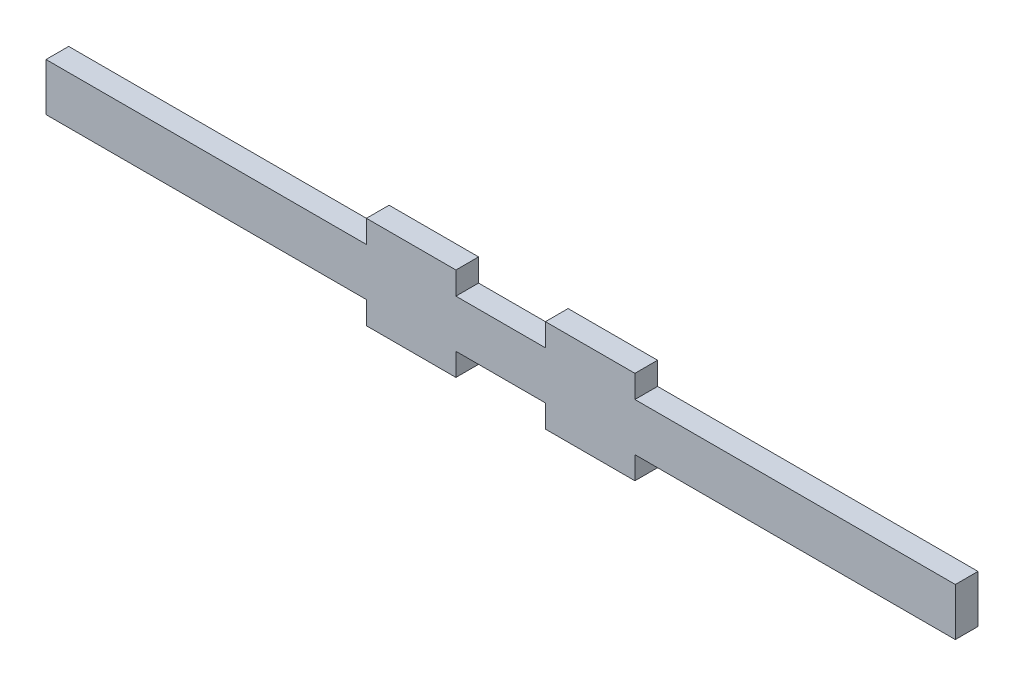
ISO-10303-21;
HEADER;
FILE_DESCRIPTION(('STEP AP214'),'2;1');
FILE_NAME('part.step','',(''),(''),'','','');
FILE_SCHEMA(('AUTOMOTIVE_DESIGN { 1 0 10303 214 1 1 1 1 }'));
ENDSEC;
DATA;
#1=APPLICATION_CONTEXT('core data for automotive mechanical design processes');
#2=APPLICATION_PROTOCOL_DEFINITION('international standard','automotive_design',2000,#1);
#3=PRODUCT_CONTEXT('',#1,'mechanical');
#4=PRODUCT('Part','Part','',(#3));
#5=PRODUCT_RELATED_PRODUCT_CATEGORY('part','',(#4));
#6=PRODUCT_DEFINITION_FORMATION('','',#4);
#7=PRODUCT_DEFINITION_CONTEXT('part definition',#1,'design');
#8=PRODUCT_DEFINITION('design','',#6,#7);
#9=PRODUCT_DEFINITION_SHAPE('','',#8);
#10=(LENGTH_UNIT() NAMED_UNIT(*) SI_UNIT(.MILLI.,.METRE.));
#11=(NAMED_UNIT(*) PLANE_ANGLE_UNIT() SI_UNIT($,.RADIAN.));
#12=(NAMED_UNIT(*) SI_UNIT($,.STERADIAN.) SOLID_ANGLE_UNIT());
#13=UNCERTAINTY_MEASURE_WITH_UNIT(LENGTH_MEASURE(1.E-05),#10,'distance_accuracy_value','');
#14=(GEOMETRIC_REPRESENTATION_CONTEXT(3) GLOBAL_UNCERTAINTY_ASSIGNED_CONTEXT((#13)) GLOBAL_UNIT_ASSIGNED_CONTEXT((#10,
#11,#12)) REPRESENTATION_CONTEXT('',''));
#15=CARTESIAN_POINT('',(0.,0.,0.));
#16=DIRECTION('',(0.,0.,1.));
#17=DIRECTION('',(1.,0.,0.));
#18=AXIS2_PLACEMENT_3D('',#15,#16,#17);
#19=CARTESIAN_POINT('',(0.,0.,4.826));
#20=DIRECTION('',(0.,1.,0.));
#21=DIRECTION('',(0.,0.,1.));
#22=AXIS2_PLACEMENT_3D('',#19,#20,#21);
#23=PLANE('',#22);
#24=DIRECTION('',(1.,0.,0.));
#25=VECTOR('',#24,1.);
#26=CARTESIAN_POINT('',(0.,0.,0.));
#27=LINE('',#26,#25);
#28=CARTESIAN_POINT('',(106.299,0.,0.));
#29=VERTEX_POINT('',#28);
#30=CARTESIAN_POINT('',(125.349,0.,0.));
#31=VERTEX_POINT('',#30);
#32=EDGE_CURVE('E193',#29,#31,#27,.T.);
#33=ORIENTED_EDGE('',*,*,#32,.T.);
#34=DIRECTION('',(0.,0.,1.));
#35=VECTOR('',#34,1.);
#36=CARTESIAN_POINT('',(125.349,0.,0.));
#37=LINE('',#36,#35);
#38=CARTESIAN_POINT('',(125.349,0.,4.826));
#39=VERTEX_POINT('',#38);
#40=EDGE_CURVE('E58',#31,#39,#37,.T.);
#41=ORIENTED_EDGE('',*,*,#40,.T.);
#42=DIRECTION('',(1.,0.,0.));
#43=VECTOR('',#42,1.);
#44=CARTESIAN_POINT('',(0.,0.,4.826));
#45=LINE('',#44,#43);
#46=CARTESIAN_POINT('',(106.299,0.,4.826));
#47=VERTEX_POINT('',#46);
#48=EDGE_CURVE('E220',#47,#39,#45,.T.);
#49=ORIENTED_EDGE('',*,*,#48,.F.);
#50=DIRECTION('',(0.,0.,1.));
#51=VECTOR('',#50,1.);
#52=CARTESIAN_POINT('',(106.299,0.,0.));
#53=LINE('',#52,#51);
#54=EDGE_CURVE('E511',#29,#47,#53,.T.);
#55=ORIENTED_EDGE('',*,*,#54,.F.);
#56=EDGE_LOOP('',(#33,#41,#49,#55));
#57=FACE_BOUND('',#56,.T.);
#58=ADVANCED_FACE('F33',(#57),#23,.F.);
#59=CARTESIAN_POINT('',(0.,19.812,4.826));
#60=DIRECTION('',(0.,-1.,0.));
#61=DIRECTION('',(0.,0.,-1.));
#62=AXIS2_PLACEMENT_3D('',#59,#60,#61);
#63=PLANE('',#62);
#64=DIRECTION('',(-1.,0.,0.));
#65=VECTOR('',#64,1.);
#66=CARTESIAN_POINT('',(0.,19.812,4.826));
#67=LINE('',#66,#65);
#68=CARTESIAN_POINT('',(87.249,19.812,4.826));
#69=VERTEX_POINT('',#68);
#70=CARTESIAN_POINT('',(68.199,19.812,4.826));
#71=VERTEX_POINT('',#70);
#72=EDGE_CURVE('E42',#69,#71,#67,.T.);
#73=ORIENTED_EDGE('',*,*,#72,.F.);
#74=DIRECTION('',(0.,0.,1.));
#75=VECTOR('',#74,1.);
#76=CARTESIAN_POINT('',(87.249,19.812,0.));
#77=LINE('',#76,#75);
#78=CARTESIAN_POINT('',(87.249,19.812,0.));
#79=VERTEX_POINT('',#78);
#80=EDGE_CURVE('E316',#79,#69,#77,.T.);
#81=ORIENTED_EDGE('',*,*,#80,.F.);
#82=DIRECTION('',(-1.,0.,0.));
#83=VECTOR('',#82,1.);
#84=CARTESIAN_POINT('',(0.,19.812,0.));
#85=LINE('',#84,#83);
#86=CARTESIAN_POINT('',(68.199,19.812,0.));
#87=VERTEX_POINT('',#86);
#88=EDGE_CURVE('E204',#79,#87,#85,.T.);
#89=ORIENTED_EDGE('',*,*,#88,.T.);
#90=DIRECTION('',(0.,0.,1.));
#91=VECTOR('',#90,1.);
#92=CARTESIAN_POINT('',(68.199,19.812,0.));
#93=LINE('',#92,#91);
#94=EDGE_CURVE('E194',#87,#71,#93,.T.);
#95=ORIENTED_EDGE('',*,*,#94,.T.);
#96=EDGE_LOOP('',(#73,#81,#89,#95));
#97=FACE_BOUND('',#96,.T.);
#98=ADVANCED_FACE('F251',(#97),#63,.F.);
#99=CARTESIAN_POINT('',(0.,0.,4.826));
#100=DIRECTION('',(1.,0.,0.));
#101=DIRECTION('',(0.,0.,-1.));
#102=AXIS2_PLACEMENT_3D('',#99,#100,#101);
#103=PLANE('',#102);
#104=DIRECTION('',(0.,-1.,0.));
#105=VECTOR('',#104,1.);
#106=CARTESIAN_POINT('',(0.,0.,0.));
#107=LINE('',#106,#105);
#108=CARTESIAN_POINT('',(0.,14.986,0.));
#109=VERTEX_POINT('',#108);
#110=CARTESIAN_POINT('',(0.,4.826,0.));
#111=VERTEX_POINT('',#110);
#112=EDGE_CURVE('E187',#109,#111,#107,.T.);
#113=ORIENTED_EDGE('',*,*,#112,.T.);
#114=DIRECTION('',(0.,0.,1.));
#115=VECTOR('',#114,1.);
#116=CARTESIAN_POINT('',(0.,4.826,0.));
#117=LINE('',#116,#115);
#118=CARTESIAN_POINT('',(0.,4.826,4.826));
#119=VERTEX_POINT('',#118);
#120=EDGE_CURVE('E171',#111,#119,#117,.T.);
#121=ORIENTED_EDGE('',*,*,#120,.T.);
#122=DIRECTION('',(0.,-1.,0.));
#123=VECTOR('',#122,1.);
#124=CARTESIAN_POINT('',(0.,0.,4.826));
#125=LINE('',#124,#123);
#126=CARTESIAN_POINT('',(0.,14.986,4.826));
#127=VERTEX_POINT('',#126);
#128=EDGE_CURVE('E215',#127,#119,#125,.T.);
#129=ORIENTED_EDGE('',*,*,#128,.F.);
#130=DIRECTION('',(0.,0.,1.));
#131=VECTOR('',#130,1.);
#132=CARTESIAN_POINT('',(0.,14.986,0.));
#133=LINE('',#132,#131);
#134=EDGE_CURVE('E192',#109,#127,#133,.T.);
#135=ORIENTED_EDGE('',*,*,#134,.F.);
#136=EDGE_LOOP('',(#113,#121,#129,#135));
#137=FACE_BOUND('',#136,.T.);
#138=ADVANCED_FACE('F35',(#137),#103,.F.);
#139=CARTESIAN_POINT('',(68.199,0.,4.826));
#140=VERTEX_POINT('',#139);
#141=CARTESIAN_POINT('',(87.249,0.,4.826));
#142=VERTEX_POINT('',#141);
#143=EDGE_CURVE('E225',#140,#142,#45,.T.);
#144=ORIENTED_EDGE('',*,*,#143,.F.);
#145=DIRECTION('',(0.,0.,1.));
#146=VECTOR('',#145,1.);
#147=CARTESIAN_POINT('',(68.199,0.,0.));
#148=LINE('',#147,#146);
#149=CARTESIAN_POINT('',(68.199,0.,0.));
#150=VERTEX_POINT('',#149);
#151=EDGE_CURVE('E179',#150,#140,#148,.T.);
#152=ORIENTED_EDGE('',*,*,#151,.F.);
#153=CARTESIAN_POINT('',(87.249,0.,0.));
#154=VERTEX_POINT('',#153);
#155=EDGE_CURVE('E197',#150,#154,#27,.T.);
#156=ORIENTED_EDGE('',*,*,#155,.T.);
#157=DIRECTION('',(0.,0.,1.));
#158=VECTOR('',#157,1.);
#159=CARTESIAN_POINT('',(87.249,0.,0.));
#160=LINE('',#159,#158);
#161=EDGE_CURVE('E512',#154,#142,#160,.T.);
#162=ORIENTED_EDGE('',*,*,#161,.T.);
#163=EDGE_LOOP('',(#144,#152,#156,#162));
#164=FACE_BOUND('',#163,.T.);
#165=ADVANCED_FACE('F259',(#164),#23,.F.);
#166=CARTESIAN_POINT('',(193.548,0.,4.826));
#167=DIRECTION('',(-1.,0.,0.));
#168=DIRECTION('',(0.,0.,1.));
#169=AXIS2_PLACEMENT_3D('',#166,#167,#168);
#170=PLANE('',#169);
#171=DIRECTION('',(0.,1.,0.));
#172=VECTOR('',#171,1.);
#173=CARTESIAN_POINT('',(193.548,0.,4.826));
#174=LINE('',#173,#172);
#175=CARTESIAN_POINT('',(193.548,4.82600000000005,4.826));
#176=VERTEX_POINT('',#175);
#177=CARTESIAN_POINT('',(193.548,14.986,4.826));
#178=VERTEX_POINT('',#177);
#179=EDGE_CURVE('E229',#176,#178,#174,.T.);
#180=ORIENTED_EDGE('',*,*,#179,.F.);
#181=DIRECTION('',(0.,0.,1.));
#182=VECTOR('',#181,1.);
#183=CARTESIAN_POINT('',(193.548,4.82600000000005,0.));
#184=LINE('',#183,#182);
#185=CARTESIAN_POINT('',(193.548,4.82600000000005,0.));
#186=VERTEX_POINT('',#185);
#187=EDGE_CURVE('E274',#186,#176,#184,.T.);
#188=ORIENTED_EDGE('',*,*,#187,.F.);
#189=DIRECTION('',(0.,1.,0.));
#190=VECTOR('',#189,1.);
#191=CARTESIAN_POINT('',(193.548,0.,0.));
#192=LINE('',#191,#190);
#193=CARTESIAN_POINT('',(193.548,14.986,0.));
#194=VERTEX_POINT('',#193);
#195=EDGE_CURVE('E203',#186,#194,#192,.T.);
#196=ORIENTED_EDGE('',*,*,#195,.T.);
#197=DIRECTION('',(0.,0.,1.));
#198=VECTOR('',#197,1.);
#199=CARTESIAN_POINT('',(193.548,14.986,0.));
#200=LINE('',#199,#198);
#201=EDGE_CURVE('E275',#194,#178,#200,.T.);
#202=ORIENTED_EDGE('',*,*,#201,.T.);
#203=EDGE_LOOP('',(#180,#188,#196,#202));
#204=FACE_BOUND('',#203,.T.);
#205=ADVANCED_FACE('F264',(#204),#170,.F.);
#206=CARTESIAN_POINT('',(125.349,19.812,0.));
#207=VERTEX_POINT('',#206);
#208=CARTESIAN_POINT('',(106.299,19.812,0.));
#209=VERTEX_POINT('',#208);
#210=EDGE_CURVE('E37',#207,#209,#85,.T.);
#211=ORIENTED_EDGE('',*,*,#210,.T.);
#212=DIRECTION('',(0.,0.,1.));
#213=VECTOR('',#212,1.);
#214=CARTESIAN_POINT('',(106.299,19.812,0.));
#215=LINE('',#214,#213);
#216=CARTESIAN_POINT('',(106.299,19.812,4.826));
#217=VERTEX_POINT('',#216);
#218=EDGE_CURVE('E319',#209,#217,#215,.T.);
#219=ORIENTED_EDGE('',*,*,#218,.T.);
#220=CARTESIAN_POINT('',(125.349,19.812,4.826));
#221=VERTEX_POINT('',#220);
#222=EDGE_CURVE('E11',#221,#217,#67,.T.);
#223=ORIENTED_EDGE('',*,*,#222,.F.);
#224=DIRECTION('',(0.,0.,1.));
#225=VECTOR('',#224,1.);
#226=CARTESIAN_POINT('',(125.349,19.812,0.));
#227=LINE('',#226,#225);
#228=EDGE_CURVE('E281',#207,#221,#227,.T.);
#229=ORIENTED_EDGE('',*,*,#228,.F.);
#230=EDGE_LOOP('',(#211,#219,#223,#229));
#231=FACE_BOUND('',#230,.T.);
#232=ADVANCED_FACE('F254',(#231),#63,.F.);
#233=CARTESIAN_POINT('',(0.,0.,4.826));
#234=DIRECTION('',(0.,0.,-1.));
#235=DIRECTION('',(-1.,0.,0.));
#236=AXIS2_PLACEMENT_3D('',#233,#234,#235);
#237=PLANE('',#236);
#238=ORIENTED_EDGE('',*,*,#128,.T.);
#239=DIRECTION('',(-1.,0.,0.));
#240=VECTOR('',#239,1.);
#241=CARTESIAN_POINT('',(0.,4.826,4.826));
#242=LINE('',#241,#240);
#243=CARTESIAN_POINT('',(68.199,4.82600000000002,4.826));
#244=VERTEX_POINT('',#243);
#245=EDGE_CURVE('E174',#244,#119,#242,.T.);
#246=ORIENTED_EDGE('',*,*,#245,.F.);
#247=DIRECTION('',(0.,1.,0.));
#248=VECTOR('',#247,1.);
#249=CARTESIAN_POINT('',(68.199,0.,4.826));
#250=LINE('',#249,#248);
#251=EDGE_CURVE('E189',#140,#244,#250,.T.);
#252=ORIENTED_EDGE('',*,*,#251,.F.);
#253=ORIENTED_EDGE('',*,*,#143,.T.);
#254=DIRECTION('',(0.,-1.,0.));
#255=VECTOR('',#254,1.);
#256=CARTESIAN_POINT('',(87.249,0.,4.826));
#257=LINE('',#256,#255);
#258=CARTESIAN_POINT('',(87.249,4.82600000000002,4.826));
#259=VERTEX_POINT('',#258);
#260=EDGE_CURVE('E505',#259,#142,#257,.T.);
#261=ORIENTED_EDGE('',*,*,#260,.F.);
#262=DIRECTION('',(-1.,0.,0.));
#263=VECTOR('',#262,1.);
#264=CARTESIAN_POINT('',(87.249,4.82600000000002,4.826));
#265=LINE('',#264,#263);
#266=CARTESIAN_POINT('',(106.299,4.82600000000002,4.826));
#267=VERTEX_POINT('',#266);
#268=EDGE_CURVE('E490',#267,#259,#265,.T.);
#269=ORIENTED_EDGE('',*,*,#268,.F.);
#270=DIRECTION('',(0.,1.,0.));
#271=VECTOR('',#270,1.);
#272=CARTESIAN_POINT('',(106.299,0.,4.826));
#273=LINE('',#272,#271);
#274=EDGE_CURVE('E497',#47,#267,#273,.T.);
#275=ORIENTED_EDGE('',*,*,#274,.F.);
#276=ORIENTED_EDGE('',*,*,#48,.T.);
#277=DIRECTION('',(0.,-1.,0.));
#278=VECTOR('',#277,1.);
#279=CARTESIAN_POINT('',(125.349,0.,4.826));
#280=LINE('',#279,#278);
#281=CARTESIAN_POINT('',(125.349,4.82600000000003,4.826));
#282=VERTEX_POINT('',#281);
#283=EDGE_CURVE('E483',#282,#39,#280,.T.);
#284=ORIENTED_EDGE('',*,*,#283,.F.);
#285=DIRECTION('',(-1.,0.,0.));
#286=VECTOR('',#285,1.);
#287=CARTESIAN_POINT('',(193.548,4.82600000000005,4.826));
#288=LINE('',#287,#286);
#289=EDGE_CURVE('E477',#176,#282,#288,.T.);
#290=ORIENTED_EDGE('',*,*,#289,.F.);
#291=ORIENTED_EDGE('',*,*,#179,.T.);
#292=DIRECTION('',(1.,0.,0.));
#293=VECTOR('',#292,1.);
#294=CARTESIAN_POINT('',(193.548,14.986,4.826));
#295=LINE('',#294,#293);
#296=CARTESIAN_POINT('',(125.349,14.986,4.826));
#297=VERTEX_POINT('',#296);
#298=EDGE_CURVE('E284',#297,#178,#295,.T.);
#299=ORIENTED_EDGE('',*,*,#298,.F.);
#300=DIRECTION('',(0.,-1.,0.));
#301=VECTOR('',#300,1.);
#302=CARTESIAN_POINT('',(125.349,19.812,4.826));
#303=LINE('',#302,#301);
#304=EDGE_CURVE('E318',#221,#297,#303,.T.);
#305=ORIENTED_EDGE('',*,*,#304,.F.);
#306=ORIENTED_EDGE('',*,*,#222,.T.);
#307=DIRECTION('',(0.,1.,0.));
#308=VECTOR('',#307,1.);
#309=CARTESIAN_POINT('',(106.299,19.812,4.826));
#310=LINE('',#309,#308);
#311=CARTESIAN_POINT('',(106.299,14.986,4.826));
#312=VERTEX_POINT('',#311);
#313=EDGE_CURVE('E300',#312,#217,#310,.T.);
#314=ORIENTED_EDGE('',*,*,#313,.F.);
#315=DIRECTION('',(1.,0.,0.));
#316=VECTOR('',#315,1.);
#317=CARTESIAN_POINT('',(87.249,14.986,4.826));
#318=LINE('',#317,#316);
#319=CARTESIAN_POINT('',(87.249,14.986,4.826));
#320=VERTEX_POINT('',#319);
#321=EDGE_CURVE('E304',#320,#312,#318,.T.);
#322=ORIENTED_EDGE('',*,*,#321,.F.);
#323=DIRECTION('',(0.,-1.,0.));
#324=VECTOR('',#323,1.);
#325=CARTESIAN_POINT('',(87.249,19.812,4.826));
#326=LINE('',#325,#324);
#327=EDGE_CURVE('E242',#69,#320,#326,.T.);
#328=ORIENTED_EDGE('',*,*,#327,.F.);
#329=ORIENTED_EDGE('',*,*,#72,.T.);
#330=DIRECTION('',(0.,1.,0.));
#331=VECTOR('',#330,1.);
#332=CARTESIAN_POINT('',(68.199,19.812,4.826));
#333=LINE('',#332,#331);
#334=CARTESIAN_POINT('',(68.199,14.986,4.826));
#335=VERTEX_POINT('',#334);
#336=EDGE_CURVE('E239',#335,#71,#333,.T.);
#337=ORIENTED_EDGE('',*,*,#336,.F.);
#338=DIRECTION('',(1.,0.,0.));
#339=VECTOR('',#338,1.);
#340=CARTESIAN_POINT('',(0.,14.986,4.826));
#341=LINE('',#340,#339);
#342=EDGE_CURVE('E249',#127,#335,#341,.T.);
#343=ORIENTED_EDGE('',*,*,#342,.F.);
#344=EDGE_LOOP('',(#238,#246,#252,#253,#261,#269,#275,#276,#284,#290,#291,#299,#305,#306,#314,
#322,#328,#329,#337,#343));
#345=FACE_BOUND('',#344,.T.);
#346=ADVANCED_FACE('F238',(#345),#237,.F.);
#347=CARTESIAN_POINT('',(0.,0.,0.));
#348=DIRECTION('',(0.,0.,-1.));
#349=DIRECTION('',(-1.,0.,0.));
#350=AXIS2_PLACEMENT_3D('',#347,#348,#349);
#351=PLANE('',#350);
#352=DIRECTION('',(-1.,0.,0.));
#353=VECTOR('',#352,1.);
#354=CARTESIAN_POINT('',(0.,4.826,0.));
#355=LINE('',#354,#353);
#356=CARTESIAN_POINT('',(68.199,4.82600000000002,0.));
#357=VERTEX_POINT('',#356);
#358=EDGE_CURVE('E50',#357,#111,#355,.T.);
#359=ORIENTED_EDGE('',*,*,#358,.T.);
#360=ORIENTED_EDGE('',*,*,#112,.F.);
#361=DIRECTION('',(1.,0.,0.));
#362=VECTOR('',#361,1.);
#363=CARTESIAN_POINT('',(0.,14.986,0.));
#364=LINE('',#363,#362);
#365=CARTESIAN_POINT('',(68.199,14.986,0.));
#366=VERTEX_POINT('',#365);
#367=EDGE_CURVE('E248',#109,#366,#364,.T.);
#368=ORIENTED_EDGE('',*,*,#367,.T.);
#369=DIRECTION('',(0.,1.,0.));
#370=VECTOR('',#369,1.);
#371=CARTESIAN_POINT('',(68.199,19.812,0.));
#372=LINE('',#371,#370);
#373=EDGE_CURVE('E290',#366,#87,#372,.T.);
#374=ORIENTED_EDGE('',*,*,#373,.T.);
#375=ORIENTED_EDGE('',*,*,#88,.F.);
#376=DIRECTION('',(0.,-1.,0.));
#377=VECTOR('',#376,1.);
#378=CARTESIAN_POINT('',(87.249,19.812,0.));
#379=LINE('',#378,#377);
#380=CARTESIAN_POINT('',(87.249,14.986,0.));
#381=VERTEX_POINT('',#380);
#382=EDGE_CURVE('E295',#79,#381,#379,.T.);
#383=ORIENTED_EDGE('',*,*,#382,.T.);
#384=DIRECTION('',(1.,0.,0.));
#385=VECTOR('',#384,1.);
#386=CARTESIAN_POINT('',(87.249,14.986,0.));
#387=LINE('',#386,#385);
#388=CARTESIAN_POINT('',(106.299,14.986,0.));
#389=VERTEX_POINT('',#388);
#390=EDGE_CURVE('E298',#381,#389,#387,.T.);
#391=ORIENTED_EDGE('',*,*,#390,.T.);
#392=DIRECTION('',(0.,1.,0.));
#393=VECTOR('',#392,1.);
#394=CARTESIAN_POINT('',(106.299,19.812,0.));
#395=LINE('',#394,#393);
#396=EDGE_CURVE('E302',#389,#209,#395,.T.);
#397=ORIENTED_EDGE('',*,*,#396,.T.);
#398=ORIENTED_EDGE('',*,*,#210,.F.);
#399=DIRECTION('',(0.,-1.,0.));
#400=VECTOR('',#399,1.);
#401=CARTESIAN_POINT('',(125.349,19.812,0.));
#402=LINE('',#401,#400);
#403=CARTESIAN_POINT('',(125.349,14.986,0.));
#404=VERTEX_POINT('',#403);
#405=EDGE_CURVE('E324',#207,#404,#402,.T.);
#406=ORIENTED_EDGE('',*,*,#405,.T.);
#407=DIRECTION('',(1.,0.,0.));
#408=VECTOR('',#407,1.);
#409=CARTESIAN_POINT('',(193.548,14.986,0.));
#410=LINE('',#409,#408);
#411=EDGE_CURVE('E288',#404,#194,#410,.T.);
#412=ORIENTED_EDGE('',*,*,#411,.T.);
#413=ORIENTED_EDGE('',*,*,#195,.F.);
#414=DIRECTION('',(-1.,0.,0.));
#415=VECTOR('',#414,1.);
#416=CARTESIAN_POINT('',(193.548,4.82600000000005,0.));
#417=LINE('',#416,#415);
#418=CARTESIAN_POINT('',(125.349,4.82600000000003,0.));
#419=VERTEX_POINT('',#418);
#420=EDGE_CURVE('E479',#186,#419,#417,.T.);
#421=ORIENTED_EDGE('',*,*,#420,.T.);
#422=DIRECTION('',(0.,-1.,0.));
#423=VECTOR('',#422,1.);
#424=CARTESIAN_POINT('',(125.349,0.,0.));
#425=LINE('',#424,#423);
#426=EDGE_CURVE('E482',#419,#31,#425,.T.);
#427=ORIENTED_EDGE('',*,*,#426,.T.);
#428=ORIENTED_EDGE('',*,*,#32,.F.);
#429=DIRECTION('',(0.,1.,0.));
#430=VECTOR('',#429,1.);
#431=CARTESIAN_POINT('',(106.299,0.,0.));
#432=LINE('',#431,#430);
#433=CARTESIAN_POINT('',(106.299,4.82600000000002,0.));
#434=VERTEX_POINT('',#433);
#435=EDGE_CURVE('E500',#29,#434,#432,.T.);
#436=ORIENTED_EDGE('',*,*,#435,.T.);
#437=DIRECTION('',(-1.,0.,0.));
#438=VECTOR('',#437,1.);
#439=CARTESIAN_POINT('',(87.249,4.82600000000002,0.));
#440=LINE('',#439,#438);
#441=CARTESIAN_POINT('',(87.249,4.82600000000002,0.));
#442=VERTEX_POINT('',#441);
#443=EDGE_CURVE('E493',#434,#442,#440,.T.);
#444=ORIENTED_EDGE('',*,*,#443,.T.);
#445=DIRECTION('',(0.,-1.,0.));
#446=VECTOR('',#445,1.);
#447=CARTESIAN_POINT('',(87.249,0.,0.));
#448=LINE('',#447,#446);
#449=EDGE_CURVE('E496',#442,#154,#448,.T.);
#450=ORIENTED_EDGE('',*,*,#449,.T.);
#451=ORIENTED_EDGE('',*,*,#155,.F.);
#452=DIRECTION('',(0.,1.,0.));
#453=VECTOR('',#452,1.);
#454=CARTESIAN_POINT('',(68.199,0.,0.));
#455=LINE('',#454,#453);
#456=EDGE_CURVE('E180',#150,#357,#455,.T.);
#457=ORIENTED_EDGE('',*,*,#456,.T.);
#458=EDGE_LOOP('',(#359,#360,#368,#374,#375,#383,#391,#397,#398,#406,#412,#413,#421,#427,#428,
#436,#444,#450,#451,#457));
#459=FACE_BOUND('',#458,.T.);
#460=ADVANCED_FACE('F185',(#459),#351,.T.);
#461=CARTESIAN_POINT('',(68.199,19.812,0.));
#462=DIRECTION('',(1.,0.,0.));
#463=DIRECTION('',(0.,1.,0.));
#464=AXIS2_PLACEMENT_3D('',#461,#462,#463);
#465=PLANE('',#464);
#466=ORIENTED_EDGE('',*,*,#336,.T.);
#467=ORIENTED_EDGE('',*,*,#94,.F.);
#468=ORIENTED_EDGE('',*,*,#373,.F.);
#469=DIRECTION('',(0.,0.,1.));
#470=VECTOR('',#469,1.);
#471=CARTESIAN_POINT('',(68.199,14.986,0.));
#472=LINE('',#471,#470);
#473=EDGE_CURVE('E200',#366,#335,#472,.T.);
#474=ORIENTED_EDGE('',*,*,#473,.T.);
#475=EDGE_LOOP('',(#466,#467,#468,#474));
#476=FACE_BOUND('',#475,.T.);
#477=ADVANCED_FACE('F244',(#476),#465,.F.);
#478=CARTESIAN_POINT('',(0.,14.986,0.));
#479=DIRECTION('',(0.,-1.,0.));
#480=DIRECTION('',(0.,0.,-1.));
#481=AXIS2_PLACEMENT_3D('',#478,#479,#480);
#482=PLANE('',#481);
#483=ORIENTED_EDGE('',*,*,#342,.T.);
#484=ORIENTED_EDGE('',*,*,#473,.F.);
#485=ORIENTED_EDGE('',*,*,#367,.F.);
#486=ORIENTED_EDGE('',*,*,#134,.T.);
#487=EDGE_LOOP('',(#483,#484,#485,#486));
#488=FACE_BOUND('',#487,.T.);
#489=ADVANCED_FACE('F292',(#488),#482,.F.);
#490=CARTESIAN_POINT('',(193.548,14.986,0.));
#491=DIRECTION('',(0.,-1.,0.));
#492=DIRECTION('',(0.,0.,-1.));
#493=AXIS2_PLACEMENT_3D('',#490,#491,#492);
#494=PLANE('',#493);
#495=ORIENTED_EDGE('',*,*,#298,.T.);
#496=ORIENTED_EDGE('',*,*,#201,.F.);
#497=ORIENTED_EDGE('',*,*,#411,.F.);
#498=DIRECTION('',(0.,0.,1.));
#499=VECTOR('',#498,1.);
#500=CARTESIAN_POINT('',(125.349,14.986,0.));
#501=LINE('',#500,#499);
#502=EDGE_CURVE('E278',#404,#297,#501,.T.);
#503=ORIENTED_EDGE('',*,*,#502,.T.);
#504=EDGE_LOOP('',(#495,#496,#497,#503));
#505=FACE_BOUND('',#504,.T.);
#506=ADVANCED_FACE('F331',(#505),#494,.F.);
#507=CARTESIAN_POINT('',(125.349,19.812,0.));
#508=DIRECTION('',(-1.,0.,0.));
#509=DIRECTION('',(0.,0.,1.));
#510=AXIS2_PLACEMENT_3D('',#507,#508,#509);
#511=PLANE('',#510);
#512=ORIENTED_EDGE('',*,*,#304,.T.);
#513=ORIENTED_EDGE('',*,*,#502,.F.);
#514=ORIENTED_EDGE('',*,*,#405,.F.);
#515=ORIENTED_EDGE('',*,*,#228,.T.);
#516=EDGE_LOOP('',(#512,#513,#514,#515));
#517=FACE_BOUND('',#516,.T.);
#518=ADVANCED_FACE('F337',(#517),#511,.F.);
#519=CARTESIAN_POINT('',(87.249,19.812,0.));
#520=DIRECTION('',(-1.,0.,0.));
#521=DIRECTION('',(0.,0.,1.));
#522=AXIS2_PLACEMENT_3D('',#519,#520,#521);
#523=PLANE('',#522);
#524=ORIENTED_EDGE('',*,*,#327,.T.);
#525=DIRECTION('',(0.,0.,1.));
#526=VECTOR('',#525,1.);
#527=CARTESIAN_POINT('',(87.249,14.986,0.));
#528=LINE('',#527,#526);
#529=EDGE_CURVE('E311',#381,#320,#528,.T.);
#530=ORIENTED_EDGE('',*,*,#529,.F.);
#531=ORIENTED_EDGE('',*,*,#382,.F.);
#532=ORIENTED_EDGE('',*,*,#80,.T.);
#533=EDGE_LOOP('',(#524,#530,#531,#532));
#534=FACE_BOUND('',#533,.T.);
#535=ADVANCED_FACE('F339',(#534),#523,.F.);
#536=CARTESIAN_POINT('',(106.299,19.812,0.));
#537=DIRECTION('',(1.,0.,0.));
#538=DIRECTION('',(0.,0.,-1.));
#539=AXIS2_PLACEMENT_3D('',#536,#537,#538);
#540=PLANE('',#539);
#541=ORIENTED_EDGE('',*,*,#313,.T.);
#542=ORIENTED_EDGE('',*,*,#218,.F.);
#543=ORIENTED_EDGE('',*,*,#396,.F.);
#544=DIRECTION('',(0.,0.,1.));
#545=VECTOR('',#544,1.);
#546=CARTESIAN_POINT('',(106.299,14.986,0.));
#547=LINE('',#546,#545);
#548=EDGE_CURVE('E321',#389,#312,#547,.T.);
#549=ORIENTED_EDGE('',*,*,#548,.T.);
#550=EDGE_LOOP('',(#541,#542,#543,#549));
#551=FACE_BOUND('',#550,.T.);
#552=ADVANCED_FACE('F335',(#551),#540,.F.);
#553=CARTESIAN_POINT('',(87.249,14.986,0.));
#554=DIRECTION('',(0.,-1.,0.));
#555=DIRECTION('',(0.,0.,-1.));
#556=AXIS2_PLACEMENT_3D('',#553,#554,#555);
#557=PLANE('',#556);
#558=ORIENTED_EDGE('',*,*,#321,.T.);
#559=ORIENTED_EDGE('',*,*,#548,.F.);
#560=ORIENTED_EDGE('',*,*,#390,.F.);
#561=ORIENTED_EDGE('',*,*,#529,.T.);
#562=EDGE_LOOP('',(#558,#559,#560,#561));
#563=FACE_BOUND('',#562,.T.);
#564=ADVANCED_FACE('F387',(#563),#557,.F.);
#565=CARTESIAN_POINT('',(87.249,4.82600000000002,0.));
#566=DIRECTION('',(0.,1.,0.));
#567=DIRECTION('',(-1.,0.,0.));
#568=AXIS2_PLACEMENT_3D('',#565,#566,#567);
#569=PLANE('',#568);
#570=ORIENTED_EDGE('',*,*,#268,.T.);
#571=DIRECTION('',(0.,0.,1.));
#572=VECTOR('',#571,1.);
#573=CARTESIAN_POINT('',(87.249,4.82600000000002,0.));
#574=LINE('',#573,#572);
#575=EDGE_CURVE('E307',#442,#259,#574,.T.);
#576=ORIENTED_EDGE('',*,*,#575,.F.);
#577=ORIENTED_EDGE('',*,*,#443,.F.);
#578=DIRECTION('',(0.,0.,1.));
#579=VECTOR('',#578,1.);
#580=CARTESIAN_POINT('',(106.299,4.82600000000002,0.));
#581=LINE('',#580,#579);
#582=EDGE_CURVE('E313',#434,#267,#581,.T.);
#583=ORIENTED_EDGE('',*,*,#582,.T.);
#584=EDGE_LOOP('',(#570,#576,#577,#583));
#585=FACE_BOUND('',#584,.T.);
#586=ADVANCED_FACE('F396',(#585),#569,.F.);
#587=CARTESIAN_POINT('',(106.299,0.,0.));
#588=DIRECTION('',(1.,0.,0.));
#589=DIRECTION('',(0.,0.,-1.));
#590=AXIS2_PLACEMENT_3D('',#587,#588,#589);
#591=PLANE('',#590);
#592=ORIENTED_EDGE('',*,*,#274,.T.);
#593=ORIENTED_EDGE('',*,*,#582,.F.);
#594=ORIENTED_EDGE('',*,*,#435,.F.);
#595=ORIENTED_EDGE('',*,*,#54,.T.);
#596=EDGE_LOOP('',(#592,#593,#594,#595));
#597=FACE_BOUND('',#596,.T.);
#598=ADVANCED_FACE('F406',(#597),#591,.F.);
#599=CARTESIAN_POINT('',(87.249,0.,0.));
#600=DIRECTION('',(-1.,0.,0.));
#601=DIRECTION('',(0.,0.,1.));
#602=AXIS2_PLACEMENT_3D('',#599,#600,#601);
#603=PLANE('',#602);
#604=ORIENTED_EDGE('',*,*,#260,.T.);
#605=ORIENTED_EDGE('',*,*,#161,.F.);
#606=ORIENTED_EDGE('',*,*,#449,.F.);
#607=ORIENTED_EDGE('',*,*,#575,.T.);
#608=EDGE_LOOP('',(#604,#605,#606,#607));
#609=FACE_BOUND('',#608,.T.);
#610=ADVANCED_FACE('F416',(#609),#603,.F.);
#611=CARTESIAN_POINT('',(193.548,4.82600000000005,0.));
#612=DIRECTION('',(0.,1.,0.));
#613=DIRECTION('',(-1.,0.,0.));
#614=AXIS2_PLACEMENT_3D('',#611,#612,#613);
#615=PLANE('',#614);
#616=ORIENTED_EDGE('',*,*,#289,.T.);
#617=DIRECTION('',(0.,0.,1.));
#618=VECTOR('',#617,1.);
#619=CARTESIAN_POINT('',(125.349,4.82600000000003,0.));
#620=LINE('',#619,#618);
#621=EDGE_CURVE('E485',#419,#282,#620,.T.);
#622=ORIENTED_EDGE('',*,*,#621,.F.);
#623=ORIENTED_EDGE('',*,*,#420,.F.);
#624=ORIENTED_EDGE('',*,*,#187,.T.);
#625=EDGE_LOOP('',(#616,#622,#623,#624));
#626=FACE_BOUND('',#625,.T.);
#627=ADVANCED_FACE('F426',(#626),#615,.F.);
#628=CARTESIAN_POINT('',(125.349,0.,0.));
#629=DIRECTION('',(-1.,0.,0.));
#630=DIRECTION('',(0.,0.,1.));
#631=AXIS2_PLACEMENT_3D('',#628,#629,#630);
#632=PLANE('',#631);
#633=ORIENTED_EDGE('',*,*,#283,.T.);
#634=ORIENTED_EDGE('',*,*,#40,.F.);
#635=ORIENTED_EDGE('',*,*,#426,.F.);
#636=ORIENTED_EDGE('',*,*,#621,.T.);
#637=EDGE_LOOP('',(#633,#634,#635,#636));
#638=FACE_BOUND('',#637,.T.);
#639=ADVANCED_FACE('F436',(#638),#632,.F.);
#640=CARTESIAN_POINT('',(0.,4.826,0.));
#641=DIRECTION('',(0.,1.,0.));
#642=DIRECTION('',(-1.,0.,0.));
#643=AXIS2_PLACEMENT_3D('',#640,#641,#642);
#644=PLANE('',#643);
#645=ORIENTED_EDGE('',*,*,#245,.T.);
#646=ORIENTED_EDGE('',*,*,#120,.F.);
#647=ORIENTED_EDGE('',*,*,#358,.F.);
#648=DIRECTION('',(0.,0.,1.));
#649=VECTOR('',#648,1.);
#650=CARTESIAN_POINT('',(68.199,4.82600000000002,0.));
#651=LINE('',#650,#649);
#652=EDGE_CURVE('E469',#357,#244,#651,.T.);
#653=ORIENTED_EDGE('',*,*,#652,.T.);
#654=EDGE_LOOP('',(#645,#646,#647,#653));
#655=FACE_BOUND('',#654,.T.);
#656=ADVANCED_FACE('F172',(#655),#644,.F.);
#657=CARTESIAN_POINT('',(68.199,0.,0.));
#658=DIRECTION('',(1.,0.,0.));
#659=DIRECTION('',(0.,1.,0.));
#660=AXIS2_PLACEMENT_3D('',#657,#658,#659);
#661=PLANE('',#660);
#662=ORIENTED_EDGE('',*,*,#251,.T.);
#663=ORIENTED_EDGE('',*,*,#652,.F.);
#664=ORIENTED_EDGE('',*,*,#456,.F.);
#665=ORIENTED_EDGE('',*,*,#151,.T.);
#666=EDGE_LOOP('',(#662,#663,#664,#665));
#667=FACE_BOUND('',#666,.T.);
#668=ADVANCED_FACE('F454',(#667),#661,.F.);
#669=CLOSED_SHELL('',(#58,#98,#138,#165,#205,#232,#346,#460,#477,#489,#506,#518,#535,#552,#564,
#586,#598,#610,#627,#639,#656,#668));
#670=MANIFOLD_SOLID_BREP('B2',#669);
#671=ADVANCED_BREP_SHAPE_REPRESENTATION('',(#18,#670),#14);
#672=SHAPE_DEFINITION_REPRESENTATION(#9,#671);
ENDSEC;
END-ISO-10303-21;
